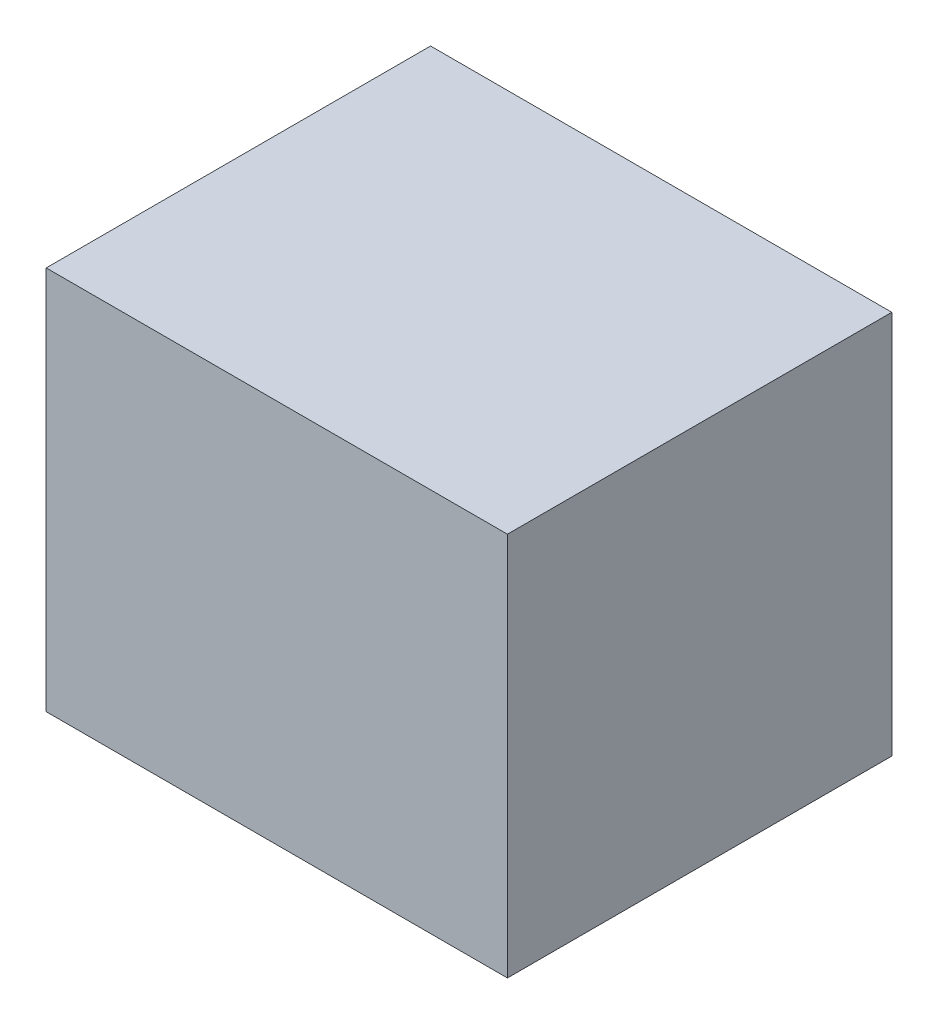
ISO-10303-21;
HEADER;
FILE_DESCRIPTION(('STEP AP214'),'2;1');
FILE_NAME('part.step','',(''),(''),'','','');
FILE_SCHEMA(('AUTOMOTIVE_DESIGN { 1 0 10303 214 1 1 1 1 }'));
ENDSEC;
DATA;
#1=APPLICATION_CONTEXT('core data for automotive mechanical design processes');
#2=APPLICATION_PROTOCOL_DEFINITION('international standard','automotive_design',2000,#1);
#3=PRODUCT_CONTEXT('',#1,'mechanical');
#4=PRODUCT('Part','Part','',(#3));
#5=PRODUCT_RELATED_PRODUCT_CATEGORY('part','',(#4));
#6=PRODUCT_DEFINITION_FORMATION('','',#4);
#7=PRODUCT_DEFINITION_CONTEXT('part definition',#1,'design');
#8=PRODUCT_DEFINITION('design','',#6,#7);
#9=PRODUCT_DEFINITION_SHAPE('','',#8);
#10=(LENGTH_UNIT() NAMED_UNIT(*) SI_UNIT(.MILLI.,.METRE.));
#11=(NAMED_UNIT(*) PLANE_ANGLE_UNIT() SI_UNIT($,.RADIAN.));
#12=(NAMED_UNIT(*) SI_UNIT($,.STERADIAN.) SOLID_ANGLE_UNIT());
#13=UNCERTAINTY_MEASURE_WITH_UNIT(LENGTH_MEASURE(1.E-05),#10,'distance_accuracy_value','');
#14=(GEOMETRIC_REPRESENTATION_CONTEXT(3) GLOBAL_UNCERTAINTY_ASSIGNED_CONTEXT((#13)) GLOBAL_UNIT_ASSIGNED_CONTEXT((#10,
#11,#12)) REPRESENTATION_CONTEXT('',''));
#15=CARTESIAN_POINT('',(0.,0.,0.));
#16=DIRECTION('',(0.,0.,1.));
#17=DIRECTION('',(1.,0.,0.));
#18=AXIS2_PLACEMENT_3D('',#15,#16,#17);
#19=CARTESIAN_POINT('',(0.,0.,500.));
#20=DIRECTION('',(1.,0.,0.));
#21=DIRECTION('',(0.,0.,-1.));
#22=AXIS2_PLACEMENT_3D('',#19,#20,#21);
#23=PLANE('',#22);
#24=DIRECTION('',(0.,-1.,0.));
#25=VECTOR('',#24,1.);
#26=CARTESIAN_POINT('',(0.,0.,0.));
#27=LINE('',#26,#25);
#28=CARTESIAN_POINT('',(0.,500.,0.));
#29=VERTEX_POINT('',#28);
#30=CARTESIAN_POINT('',(0.,0.,0.));
#31=VERTEX_POINT('',#30);
#32=EDGE_CURVE('E107',#29,#31,#27,.T.);
#33=ORIENTED_EDGE('',*,*,#32,.T.);
#34=DIRECTION('',(0.,0.,-1.));
#35=VECTOR('',#34,1.);
#36=CARTESIAN_POINT('',(0.,0.,500.));
#37=LINE('',#36,#35);
#38=CARTESIAN_POINT('',(0.,0.,500.));
#39=VERTEX_POINT('',#38);
#40=EDGE_CURVE('E11',#39,#31,#37,.T.);
#41=ORIENTED_EDGE('',*,*,#40,.F.);
#42=DIRECTION('',(0.,-1.,0.));
#43=VECTOR('',#42,1.);
#44=CARTESIAN_POINT('',(0.,0.,500.));
#45=LINE('',#44,#43);
#46=CARTESIAN_POINT('',(0.,500.,500.));
#47=VERTEX_POINT('',#46);
#48=EDGE_CURVE('E91',#47,#39,#45,.T.);
#49=ORIENTED_EDGE('',*,*,#48,.F.);
#50=DIRECTION('',(0.,0.,-1.));
#51=VECTOR('',#50,1.);
#52=CARTESIAN_POINT('',(0.,500.,500.));
#53=LINE('',#52,#51);
#54=EDGE_CURVE('E103',#47,#29,#53,.T.);
#55=ORIENTED_EDGE('',*,*,#54,.T.);
#56=EDGE_LOOP('',(#33,#41,#49,#55));
#57=FACE_BOUND('',#56,.T.);
#58=ADVANCED_FACE('F39',(#57),#23,.F.);
#59=CARTESIAN_POINT('',(0.,0.,500.));
#60=DIRECTION('',(0.,1.,0.));
#61=DIRECTION('',(0.,0.,1.));
#62=AXIS2_PLACEMENT_3D('',#59,#60,#61);
#63=PLANE('',#62);
#64=DIRECTION('',(1.,0.,0.));
#65=VECTOR('',#64,1.);
#66=CARTESIAN_POINT('',(0.,0.,0.));
#67=LINE('',#66,#65);
#68=CARTESIAN_POINT('',(600.,0.,0.));
#69=VERTEX_POINT('',#68);
#70=EDGE_CURVE('E96',#31,#69,#67,.T.);
#71=ORIENTED_EDGE('',*,*,#70,.T.);
#72=DIRECTION('',(0.,0.,-1.));
#73=VECTOR('',#72,1.);
#74=CARTESIAN_POINT('',(600.,0.,500.));
#75=LINE('',#74,#73);
#76=CARTESIAN_POINT('',(600.,0.,500.));
#77=VERTEX_POINT('',#76);
#78=EDGE_CURVE('E48',#77,#69,#75,.T.);
#79=ORIENTED_EDGE('',*,*,#78,.F.);
#80=DIRECTION('',(1.,0.,0.));
#81=VECTOR('',#80,1.);
#82=CARTESIAN_POINT('',(0.,0.,500.));
#83=LINE('',#82,#81);
#84=EDGE_CURVE('E86',#39,#77,#83,.T.);
#85=ORIENTED_EDGE('',*,*,#84,.F.);
#86=ORIENTED_EDGE('',*,*,#40,.T.);
#87=EDGE_LOOP('',(#71,#79,#85,#86));
#88=FACE_BOUND('',#87,.T.);
#89=ADVANCED_FACE('F95',(#88),#63,.F.);
#90=CARTESIAN_POINT('',(600.,0.,500.));
#91=DIRECTION('',(-1.,0.,0.));
#92=DIRECTION('',(0.,0.,1.));
#93=AXIS2_PLACEMENT_3D('',#90,#91,#92);
#94=PLANE('',#93);
#95=DIRECTION('',(0.,1.,0.));
#96=VECTOR('',#95,1.);
#97=CARTESIAN_POINT('',(600.,0.,0.));
#98=LINE('',#97,#96);
#99=CARTESIAN_POINT('',(600.,500.,0.));
#100=VERTEX_POINT('',#99);
#101=EDGE_CURVE('E73',#69,#100,#98,.T.);
#102=ORIENTED_EDGE('',*,*,#101,.T.);
#103=DIRECTION('',(0.,0.,-1.));
#104=VECTOR('',#103,1.);
#105=CARTESIAN_POINT('',(600.,500.,500.));
#106=LINE('',#105,#104);
#107=CARTESIAN_POINT('',(600.,500.,500.));
#108=VERTEX_POINT('',#107);
#109=EDGE_CURVE('E98',#108,#100,#106,.T.);
#110=ORIENTED_EDGE('',*,*,#109,.F.);
#111=DIRECTION('',(0.,1.,0.));
#112=VECTOR('',#111,1.);
#113=CARTESIAN_POINT('',(600.,0.,500.));
#114=LINE('',#113,#112);
#115=EDGE_CURVE('E89',#77,#108,#114,.T.);
#116=ORIENTED_EDGE('',*,*,#115,.F.);
#117=ORIENTED_EDGE('',*,*,#78,.T.);
#118=EDGE_LOOP('',(#102,#110,#116,#117));
#119=FACE_BOUND('',#118,.T.);
#120=ADVANCED_FACE('F99',(#119),#94,.F.);
#121=CARTESIAN_POINT('',(0.,500.,500.));
#122=DIRECTION('',(0.,-1.,0.));
#123=DIRECTION('',(0.,0.,-1.));
#124=AXIS2_PLACEMENT_3D('',#121,#122,#123);
#125=PLANE('',#124);
#126=DIRECTION('',(-1.,0.,0.));
#127=VECTOR('',#126,1.);
#128=CARTESIAN_POINT('',(0.,500.,0.));
#129=LINE('',#128,#127);
#130=EDGE_CURVE('E79',#100,#29,#129,.T.);
#131=ORIENTED_EDGE('',*,*,#130,.T.);
#132=ORIENTED_EDGE('',*,*,#54,.F.);
#133=DIRECTION('',(-1.,0.,0.));
#134=VECTOR('',#133,1.);
#135=CARTESIAN_POINT('',(0.,500.,500.));
#136=LINE('',#135,#134);
#137=EDGE_CURVE('E56',#108,#47,#136,.T.);
#138=ORIENTED_EDGE('',*,*,#137,.F.);
#139=ORIENTED_EDGE('',*,*,#109,.T.);
#140=EDGE_LOOP('',(#131,#132,#138,#139));
#141=FACE_BOUND('',#140,.T.);
#142=ADVANCED_FACE('F120',(#141),#125,.F.);
#143=CARTESIAN_POINT('',(0.,0.,500.));
#144=DIRECTION('',(0.,0.,-1.));
#145=DIRECTION('',(-1.,0.,0.));
#146=AXIS2_PLACEMENT_3D('',#143,#144,#145);
#147=PLANE('',#146);
#148=ORIENTED_EDGE('',*,*,#48,.T.);
#149=ORIENTED_EDGE('',*,*,#84,.T.);
#150=ORIENTED_EDGE('',*,*,#115,.T.);
#151=ORIENTED_EDGE('',*,*,#137,.T.);
#152=EDGE_LOOP('',(#148,#149,#150,#151));
#153=FACE_BOUND('',#152,.T.);
#154=ADVANCED_FACE('F87',(#153),#147,.F.);
#155=CARTESIAN_POINT('',(0.,0.,0.));
#156=DIRECTION('',(0.,0.,-1.));
#157=DIRECTION('',(-1.,0.,0.));
#158=AXIS2_PLACEMENT_3D('',#155,#156,#157);
#159=PLANE('',#158);
#160=ORIENTED_EDGE('',*,*,#32,.F.);
#161=ORIENTED_EDGE('',*,*,#130,.F.);
#162=ORIENTED_EDGE('',*,*,#101,.F.);
#163=ORIENTED_EDGE('',*,*,#70,.F.);
#164=EDGE_LOOP('',(#160,#161,#162,#163));
#165=FACE_BOUND('',#164,.T.);
#166=ADVANCED_FACE('F123',(#165),#159,.T.);
#167=CLOSED_SHELL('',(#58,#89,#120,#142,#154,#166));
#168=MANIFOLD_SOLID_BREP('B2',#167);
#169=ADVANCED_BREP_SHAPE_REPRESENTATION('',(#18,#168),#14);
#170=SHAPE_DEFINITION_REPRESENTATION(#9,#169);
ENDSEC;
END-ISO-10303-21;
